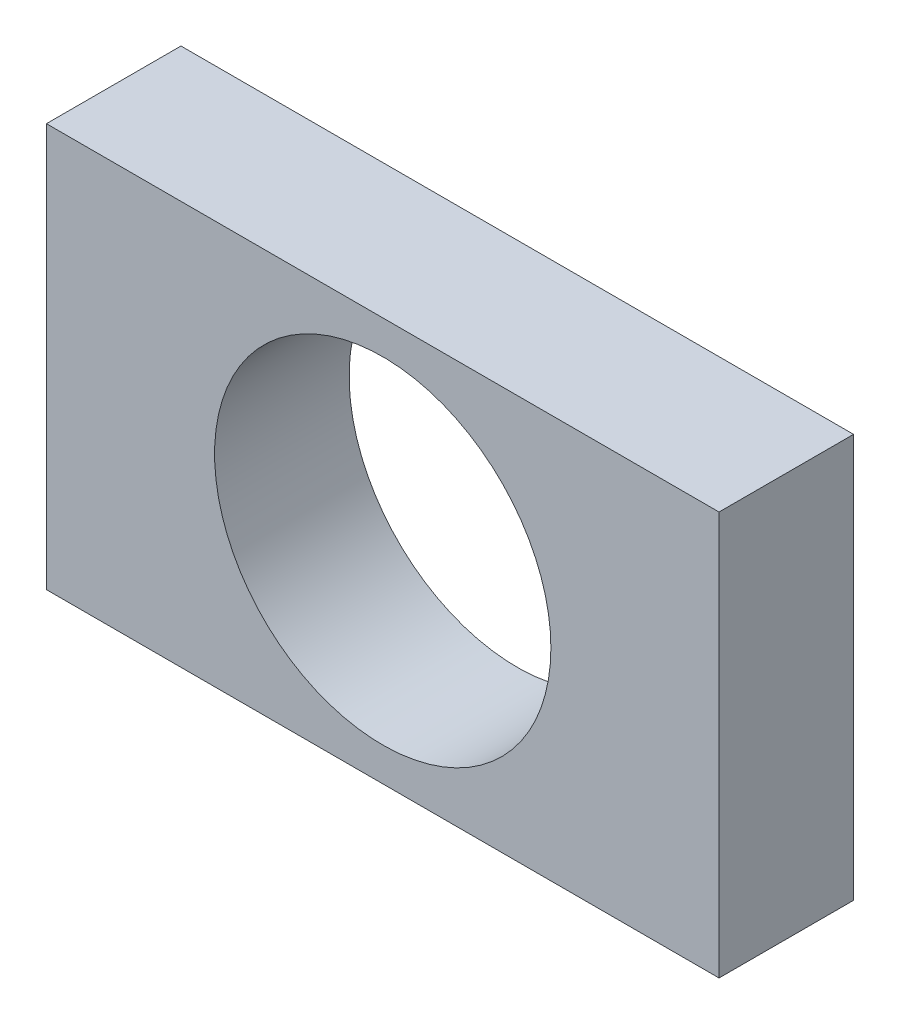
ISO-10303-21;
HEADER;
FILE_DESCRIPTION(('STEP AP214'),'2;1');
FILE_NAME('part.step','',(''),(''),'','','');
FILE_SCHEMA(('AUTOMOTIVE_DESIGN { 1 0 10303 214 1 1 1 1 }'));
ENDSEC;
DATA;
#1=APPLICATION_CONTEXT('core data for automotive mechanical design processes');
#2=APPLICATION_PROTOCOL_DEFINITION('international standard','automotive_design',2000,#1);
#3=PRODUCT_CONTEXT('',#1,'mechanical');
#4=PRODUCT('Part','Part','',(#3));
#5=PRODUCT_RELATED_PRODUCT_CATEGORY('part','',(#4));
#6=PRODUCT_DEFINITION_FORMATION('','',#4);
#7=PRODUCT_DEFINITION_CONTEXT('part definition',#1,'design');
#8=PRODUCT_DEFINITION('design','',#6,#7);
#9=PRODUCT_DEFINITION_SHAPE('','',#8);
#10=(LENGTH_UNIT() NAMED_UNIT(*) SI_UNIT(.MILLI.,.METRE.));
#11=(NAMED_UNIT(*) PLANE_ANGLE_UNIT() SI_UNIT($,.RADIAN.));
#12=(NAMED_UNIT(*) SI_UNIT($,.STERADIAN.) SOLID_ANGLE_UNIT());
#13=UNCERTAINTY_MEASURE_WITH_UNIT(LENGTH_MEASURE(1.E-05),#10,'distance_accuracy_value','');
#14=(GEOMETRIC_REPRESENTATION_CONTEXT(3) GLOBAL_UNCERTAINTY_ASSIGNED_CONTEXT((#13)) GLOBAL_UNIT_ASSIGNED_CONTEXT((#10,
#11,#12)) REPRESENTATION_CONTEXT('',''));
#15=CARTESIAN_POINT('',(0.,0.,0.));
#16=DIRECTION('',(0.,0.,1.));
#17=DIRECTION('',(1.,0.,0.));
#18=AXIS2_PLACEMENT_3D('',#15,#16,#17);
#19=CARTESIAN_POINT('',(0.,0.,20.));
#20=DIRECTION('',(0.,0.,-1.));
#21=DIRECTION('',(-1.,0.,0.));
#22=AXIS2_PLACEMENT_3D('',#19,#20,#21);
#23=PLANE('',#22);
#24=DIRECTION('',(0.,1.,0.));
#25=VECTOR('',#24,1.);
#26=CARTESIAN_POINT('',(50.,-30.,20.));
#27=LINE('',#26,#25);
#28=CARTESIAN_POINT('',(50.,-30.,20.));
#29=VERTEX_POINT('',#28);
#30=CARTESIAN_POINT('',(50.,30.,20.));
#31=VERTEX_POINT('',#30);
#32=EDGE_CURVE('E86',#29,#31,#27,.T.);
#33=ORIENTED_EDGE('',*,*,#32,.T.);
#34=DIRECTION('',(-1.,0.,0.));
#35=VECTOR('',#34,1.);
#36=CARTESIAN_POINT('',(-50.,30.,20.));
#37=LINE('',#36,#35);
#38=CARTESIAN_POINT('',(-50.,30.,20.));
#39=VERTEX_POINT('',#38);
#40=EDGE_CURVE('E81',#31,#39,#37,.T.);
#41=ORIENTED_EDGE('',*,*,#40,.T.);
#42=DIRECTION('',(0.,-1.,0.));
#43=VECTOR('',#42,1.);
#44=CARTESIAN_POINT('',(-50.,-30.,20.));
#45=LINE('',#44,#43);
#46=CARTESIAN_POINT('',(-50.,-30.,20.));
#47=VERTEX_POINT('',#46);
#48=EDGE_CURVE('E84',#39,#47,#45,.T.);
#49=ORIENTED_EDGE('',*,*,#48,.T.);
#50=DIRECTION('',(1.,0.,0.));
#51=VECTOR('',#50,1.);
#52=CARTESIAN_POINT('',(-50.,-30.,20.));
#53=LINE('',#52,#51);
#54=EDGE_CURVE('E51',#47,#29,#53,.T.);
#55=ORIENTED_EDGE('',*,*,#54,.T.);
#56=EDGE_LOOP('',(#33,#41,#49,#55));
#57=FACE_BOUND('',#56,.T.);
#58=CARTESIAN_POINT('',(0.,0.,20.));
#59=DIRECTION('',(0.,0.,1.));
#60=DIRECTION('',(1.,0.,0.));
#61=AXIS2_PLACEMENT_3D('',#58,#59,#60);
#62=CIRCLE('',#61,25.);
#63=CARTESIAN_POINT('',(25.,0.,20.));
#64=VERTEX_POINT('',#63);
#65=EDGE_CURVE('E101',#64,#64,#62,.T.);
#66=ORIENTED_EDGE('',*,*,#65,.F.);
#67=EDGE_LOOP('',(#66));
#68=FACE_BOUND('',#67,.T.);
#69=ADVANCED_FACE('F34',(#57,#68),#23,.F.);
#70=CARTESIAN_POINT('',(0.,0.,0.));
#71=DIRECTION('',(0.,0.,-1.));
#72=DIRECTION('',(-1.,0.,0.));
#73=AXIS2_PLACEMENT_3D('',#70,#71,#72);
#74=PLANE('',#73);
#75=DIRECTION('',(0.,1.,0.));
#76=VECTOR('',#75,1.);
#77=CARTESIAN_POINT('',(50.,-30.,0.));
#78=LINE('',#77,#76);
#79=CARTESIAN_POINT('',(50.,-30.,0.));
#80=VERTEX_POINT('',#79);
#81=CARTESIAN_POINT('',(50.,30.,0.));
#82=VERTEX_POINT('',#81);
#83=EDGE_CURVE('E98',#80,#82,#78,.T.);
#84=ORIENTED_EDGE('',*,*,#83,.F.);
#85=DIRECTION('',(1.,0.,0.));
#86=VECTOR('',#85,1.);
#87=CARTESIAN_POINT('',(-50.,-30.,0.));
#88=LINE('',#87,#86);
#89=CARTESIAN_POINT('',(-50.,-30.,0.));
#90=VERTEX_POINT('',#89);
#91=EDGE_CURVE('E74',#90,#80,#88,.T.);
#92=ORIENTED_EDGE('',*,*,#91,.F.);
#93=DIRECTION('',(0.,-1.,0.));
#94=VECTOR('',#93,1.);
#95=CARTESIAN_POINT('',(-50.,-30.,0.));
#96=LINE('',#95,#94);
#97=CARTESIAN_POINT('',(-50.,30.,0.));
#98=VERTEX_POINT('',#97);
#99=EDGE_CURVE('E68',#98,#90,#96,.T.);
#100=ORIENTED_EDGE('',*,*,#99,.F.);
#101=DIRECTION('',(-1.,0.,0.));
#102=VECTOR('',#101,1.);
#103=CARTESIAN_POINT('',(-50.,30.,0.));
#104=LINE('',#103,#102);
#105=EDGE_CURVE('E90',#82,#98,#104,.T.);
#106=ORIENTED_EDGE('',*,*,#105,.F.);
#107=EDGE_LOOP('',(#84,#92,#100,#106));
#108=FACE_BOUND('',#107,.T.);
#109=CARTESIAN_POINT('',(0.,0.,0.));
#110=DIRECTION('',(0.,0.,1.));
#111=DIRECTION('',(1.,0.,0.));
#112=AXIS2_PLACEMENT_3D('',#109,#110,#111);
#113=CIRCLE('',#112,25.);
#114=CARTESIAN_POINT('',(25.,0.,0.));
#115=VERTEX_POINT('',#114);
#116=EDGE_CURVE('E113',#115,#115,#113,.T.);
#117=ORIENTED_EDGE('',*,*,#116,.T.);
#118=EDGE_LOOP('',(#117));
#119=FACE_BOUND('',#118,.T.);
#120=ADVANCED_FACE('F109',(#108,#119),#74,.T.);
#121=CARTESIAN_POINT('',(50.,-30.,20.));
#122=DIRECTION('',(-1.,0.,0.));
#123=DIRECTION('',(0.,0.,1.));
#124=AXIS2_PLACEMENT_3D('',#121,#122,#123);
#125=PLANE('',#124);
#126=ORIENTED_EDGE('',*,*,#83,.T.);
#127=DIRECTION('',(0.,0.,-1.));
#128=VECTOR('',#127,1.);
#129=CARTESIAN_POINT('',(50.,30.,20.));
#130=LINE('',#129,#128);
#131=EDGE_CURVE('E11',#31,#82,#130,.T.);
#132=ORIENTED_EDGE('',*,*,#131,.F.);
#133=ORIENTED_EDGE('',*,*,#32,.F.);
#134=DIRECTION('',(0.,0.,-1.));
#135=VECTOR('',#134,1.);
#136=CARTESIAN_POINT('',(50.,-30.,20.));
#137=LINE('',#136,#135);
#138=EDGE_CURVE('E94',#29,#80,#137,.T.);
#139=ORIENTED_EDGE('',*,*,#138,.T.);
#140=EDGE_LOOP('',(#126,#132,#133,#139));
#141=FACE_BOUND('',#140,.T.);
#142=ADVANCED_FACE('F36',(#141),#125,.F.);
#143=CARTESIAN_POINT('',(-50.,30.,20.));
#144=DIRECTION('',(0.,-1.,0.));
#145=DIRECTION('',(0.,0.,-1.));
#146=AXIS2_PLACEMENT_3D('',#143,#144,#145);
#147=PLANE('',#146);
#148=ORIENTED_EDGE('',*,*,#105,.T.);
#149=DIRECTION('',(0.,0.,-1.));
#150=VECTOR('',#149,1.);
#151=CARTESIAN_POINT('',(-50.,30.,20.));
#152=LINE('',#151,#150);
#153=EDGE_CURVE('E43',#39,#98,#152,.T.);
#154=ORIENTED_EDGE('',*,*,#153,.F.);
#155=ORIENTED_EDGE('',*,*,#40,.F.);
#156=ORIENTED_EDGE('',*,*,#131,.T.);
#157=EDGE_LOOP('',(#148,#154,#155,#156));
#158=FACE_BOUND('',#157,.T.);
#159=ADVANCED_FACE('F89',(#158),#147,.F.);
#160=CARTESIAN_POINT('',(-50.,-30.,20.));
#161=DIRECTION('',(1.,0.,0.));
#162=DIRECTION('',(0.,0.,-1.));
#163=AXIS2_PLACEMENT_3D('',#160,#161,#162);
#164=PLANE('',#163);
#165=ORIENTED_EDGE('',*,*,#99,.T.);
#166=DIRECTION('',(0.,0.,-1.));
#167=VECTOR('',#166,1.);
#168=CARTESIAN_POINT('',(-50.,-30.,20.));
#169=LINE('',#168,#167);
#170=EDGE_CURVE('E91',#47,#90,#169,.T.);
#171=ORIENTED_EDGE('',*,*,#170,.F.);
#172=ORIENTED_EDGE('',*,*,#48,.F.);
#173=ORIENTED_EDGE('',*,*,#153,.T.);
#174=EDGE_LOOP('',(#165,#171,#172,#173));
#175=FACE_BOUND('',#174,.T.);
#176=ADVANCED_FACE('F92',(#175),#164,.F.);
#177=CARTESIAN_POINT('',(-50.,-30.,20.));
#178=DIRECTION('',(0.,1.,0.));
#179=DIRECTION('',(0.,0.,1.));
#180=AXIS2_PLACEMENT_3D('',#177,#178,#179);
#181=PLANE('',#180);
#182=ORIENTED_EDGE('',*,*,#91,.T.);
#183=ORIENTED_EDGE('',*,*,#138,.F.);
#184=ORIENTED_EDGE('',*,*,#54,.F.);
#185=ORIENTED_EDGE('',*,*,#170,.T.);
#186=EDGE_LOOP('',(#182,#183,#184,#185));
#187=FACE_BOUND('',#186,.T.);
#188=ADVANCED_FACE('F106',(#187),#181,.F.);
#189=CARTESIAN_POINT('',(0.,0.,20.));
#190=DIRECTION('',(0.,0.,-1.));
#191=DIRECTION('',(-1.,0.,0.));
#192=AXIS2_PLACEMENT_3D('',#189,#190,#191);
#193=CYLINDRICAL_SURFACE('',#192,25.);
#194=ORIENTED_EDGE('',*,*,#65,.T.);
#195=EDGE_LOOP('',(#194));
#196=FACE_BOUND('',#195,.T.);
#197=ORIENTED_EDGE('',*,*,#116,.F.);
#198=EDGE_LOOP('',(#197));
#199=FACE_BOUND('',#198,.T.);
#200=ADVANCED_FACE('F119',(#196,#199),#193,.F.);
#201=CLOSED_SHELL('',(#69,#120,#142,#159,#176,#188,#200));
#202=MANIFOLD_SOLID_BREP('B2',#201);
#203=ADVANCED_BREP_SHAPE_REPRESENTATION('',(#18,#202),#14);
#204=SHAPE_DEFINITION_REPRESENTATION(#9,#203);
ENDSEC;
END-ISO-10303-21;
